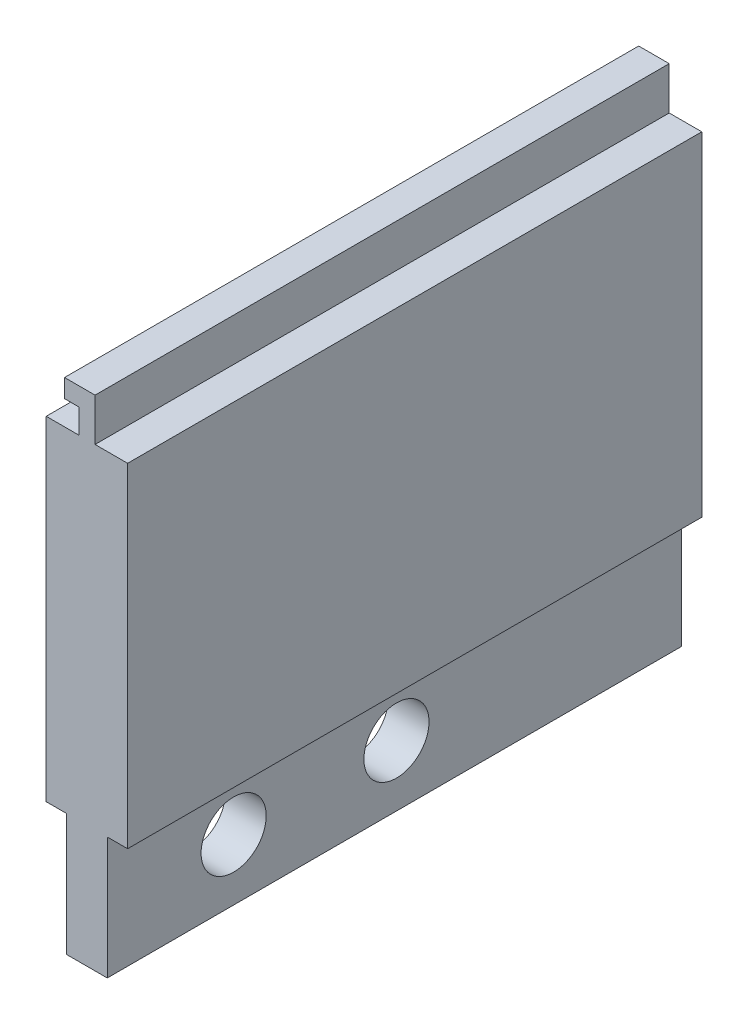
ISO-10303-21;
HEADER;
FILE_DESCRIPTION(('STEP AP214'),'2;1');
FILE_NAME('part.step','',(''),(''),'','','');
FILE_SCHEMA(('AUTOMOTIVE_DESIGN { 1 0 10303 214 1 1 1 1 }'));
ENDSEC;
DATA;
#1=APPLICATION_CONTEXT('core data for automotive mechanical design processes');
#2=APPLICATION_PROTOCOL_DEFINITION('international standard','automotive_design',2000,#1);
#3=PRODUCT_CONTEXT('',#1,'mechanical');
#4=PRODUCT('Part','Part','',(#3));
#5=PRODUCT_RELATED_PRODUCT_CATEGORY('part','',(#4));
#6=PRODUCT_DEFINITION_FORMATION('','',#4);
#7=PRODUCT_DEFINITION_CONTEXT('part definition',#1,'design');
#8=PRODUCT_DEFINITION('design','',#6,#7);
#9=PRODUCT_DEFINITION_SHAPE('','',#8);
#10=(LENGTH_UNIT() NAMED_UNIT(*) SI_UNIT(.MILLI.,.METRE.));
#11=(NAMED_UNIT(*) PLANE_ANGLE_UNIT() SI_UNIT($,.RADIAN.));
#12=(NAMED_UNIT(*) SI_UNIT($,.STERADIAN.) SOLID_ANGLE_UNIT());
#13=UNCERTAINTY_MEASURE_WITH_UNIT(LENGTH_MEASURE(1.E-05),#10,'distance_accuracy_value','');
#14=(GEOMETRIC_REPRESENTATION_CONTEXT(3) GLOBAL_UNCERTAINTY_ASSIGNED_CONTEXT((#13)) GLOBAL_UNIT_ASSIGNED_CONTEXT((#10,
#11,#12)) REPRESENTATION_CONTEXT('',''));
#15=CARTESIAN_POINT('',(0.,0.,0.));
#16=DIRECTION('',(0.,0.,1.));
#17=DIRECTION('',(1.,0.,0.));
#18=AXIS2_PLACEMENT_3D('',#15,#16,#17);
#19=CARTESIAN_POINT('',(0.,-6.19999999999896,-20.));
#20=DIRECTION('',(0.,1.,0.));
#21=DIRECTION('',(0.,0.,1.));
#22=AXIS2_PLACEMENT_3D('',#19,#20,#21);
#23=PLANE('',#22);
#24=DIRECTION('',(-1.,0.,0.));
#25=VECTOR('',#24,1.);
#26=CARTESIAN_POINT('',(0.,-6.19999999999896,0.));
#27=LINE('',#26,#25);
#28=CARTESIAN_POINT('',(2.39999999999911,-6.19999999999896,0.));
#29=VERTEX_POINT('',#28);
#30=CARTESIAN_POINT('',(0.899999999999033,-6.19999999999896,0.));
#31=VERTEX_POINT('',#30);
#32=EDGE_CURVE('E189',#29,#31,#27,.T.);
#33=ORIENTED_EDGE('',*,*,#32,.F.);
#34=DIRECTION('',(0.,0.,1.));
#35=VECTOR('',#34,1.);
#36=CARTESIAN_POINT('',(2.39999999999911,-6.19999999999896,-20.));
#37=LINE('',#36,#35);
#38=CARTESIAN_POINT('',(2.39999999999911,-6.19999999999896,-28.2085117858416));
#39=VERTEX_POINT('',#38);
#40=EDGE_CURVE('E11',#39,#29,#37,.T.);
#41=ORIENTED_EDGE('',*,*,#40,.F.);
#42=DIRECTION('',(-1.,0.,0.));
#43=VECTOR('',#42,1.);
#44=CARTESIAN_POINT('',(0.899999999999032,-6.19999999999896,-28.2085117858416));
#45=LINE('',#44,#43);
#46=CARTESIAN_POINT('',(0.899999999999033,-6.19999999999896,-28.2085117858416));
#47=VERTEX_POINT('',#46);
#48=EDGE_CURVE('E331',#39,#47,#45,.T.);
#49=ORIENTED_EDGE('',*,*,#48,.T.);
#50=DIRECTION('',(0.,0.,1.));
#51=VECTOR('',#50,1.);
#52=CARTESIAN_POINT('',(0.899999999999033,-6.19999999999896,-20.));
#53=LINE('',#52,#51);
#54=EDGE_CURVE('E232',#47,#31,#53,.T.);
#55=ORIENTED_EDGE('',*,*,#54,.T.);
#56=EDGE_LOOP('',(#33,#41,#49,#55));
#57=FACE_BOUND('',#56,.T.);
#58=ADVANCED_FACE('F45',(#57),#23,.T.);
#59=CARTESIAN_POINT('',(2.39999999999911,0.,-20.));
#60=DIRECTION('',(-1.,0.,0.));
#61=DIRECTION('',(0.,-1.,0.));
#62=AXIS2_PLACEMENT_3D('',#59,#60,#61);
#63=PLANE('',#62);
#64=DIRECTION('',(0.,-1.,0.));
#65=VECTOR('',#64,1.);
#66=CARTESIAN_POINT('',(2.39999999999911,0.,0.));
#67=LINE('',#66,#65);
#68=CARTESIAN_POINT('',(2.39999999999912,-8.29999999999899,0.));
#69=VERTEX_POINT('',#68);
#70=EDGE_CURVE('E230',#29,#69,#67,.T.);
#71=ORIENTED_EDGE('',*,*,#70,.T.);
#72=DIRECTION('',(0.,0.,1.));
#73=VECTOR('',#72,1.);
#74=CARTESIAN_POINT('',(2.39999999999912,-8.29999999999899,-20.));
#75=LINE('',#74,#73);
#76=CARTESIAN_POINT('',(2.39999999999912,-8.29999999999899,-28.2085117858416));
#77=VERTEX_POINT('',#76);
#78=EDGE_CURVE('E54',#77,#69,#75,.T.);
#79=ORIENTED_EDGE('',*,*,#78,.F.);
#80=DIRECTION('',(0.,1.,0.));
#81=VECTOR('',#80,1.);
#82=CARTESIAN_POINT('',(2.39999999999911,-6.19999999999896,-28.2085117858416));
#83=LINE('',#82,#81);
#84=EDGE_CURVE('E329',#77,#39,#83,.T.);
#85=ORIENTED_EDGE('',*,*,#84,.T.);
#86=ORIENTED_EDGE('',*,*,#40,.T.);
#87=EDGE_LOOP('',(#71,#79,#85,#86));
#88=FACE_BOUND('',#87,.T.);
#89=ADVANCED_FACE('F341',(#88),#63,.F.);
#90=CARTESIAN_POINT('',(0.,-8.29999999999899,-20.));
#91=DIRECTION('',(0.,1.,0.));
#92=DIRECTION('',(-1.,0.,0.));
#93=AXIS2_PLACEMENT_3D('',#90,#91,#92);
#94=PLANE('',#93);
#95=DIRECTION('',(-1.,0.,0.));
#96=VECTOR('',#95,1.);
#97=CARTESIAN_POINT('',(0.,-8.29999999999899,0.));
#98=LINE('',#97,#96);
#99=CARTESIAN_POINT('',(3.99999999999911,-8.29999999999899,0.));
#100=VERTEX_POINT('',#99);
#101=EDGE_CURVE('E207',#100,#69,#98,.T.);
#102=ORIENTED_EDGE('',*,*,#101,.F.);
#103=DIRECTION('',(0.,0.,1.));
#104=VECTOR('',#103,1.);
#105=CARTESIAN_POINT('',(3.99999999999911,-8.29999999999899,-20.));
#106=LINE('',#105,#104);
#107=CARTESIAN_POINT('',(3.99999999999911,-8.29999999999899,-28.2085117858416));
#108=VERTEX_POINT('',#107);
#109=EDGE_CURVE('E236',#108,#100,#106,.T.);
#110=ORIENTED_EDGE('',*,*,#109,.F.);
#111=DIRECTION('',(-1.,0.,0.));
#112=VECTOR('',#111,1.);
#113=CARTESIAN_POINT('',(2.39999999999911,-8.29999999999899,-28.2085117858416));
#114=LINE('',#113,#112);
#115=EDGE_CURVE('E326',#108,#77,#114,.T.);
#116=ORIENTED_EDGE('',*,*,#115,.T.);
#117=ORIENTED_EDGE('',*,*,#78,.T.);
#118=EDGE_LOOP('',(#102,#110,#116,#117));
#119=FACE_BOUND('',#118,.T.);
#120=ADVANCED_FACE('F368',(#119),#94,.T.);
#121=CARTESIAN_POINT('',(3.9999999999991,0.,-20.));
#122=DIRECTION('',(-1.,0.,0.));
#123=DIRECTION('',(0.,-1.,0.));
#124=AXIS2_PLACEMENT_3D('',#121,#122,#123);
#125=PLANE('',#124);
#126=DIRECTION('',(0.,-1.,0.));
#127=VECTOR('',#126,1.);
#128=CARTESIAN_POINT('',(3.9999999999991,0.,0.));
#129=LINE('',#128,#127);
#130=CARTESIAN_POINT('',(3.99999999999912,-24.699999999999,0.));
#131=VERTEX_POINT('',#130);
#132=EDGE_CURVE('E227',#100,#131,#129,.T.);
#133=ORIENTED_EDGE('',*,*,#132,.T.);
#134=DIRECTION('',(0.,0.,1.));
#135=VECTOR('',#134,1.);
#136=CARTESIAN_POINT('',(3.99999999999912,-24.699999999999,-20.));
#137=LINE('',#136,#135);
#138=CARTESIAN_POINT('',(3.99999999999912,-24.699999999999,-28.2085117858416));
#139=VERTEX_POINT('',#138);
#140=EDGE_CURVE('E239',#139,#131,#137,.T.);
#141=ORIENTED_EDGE('',*,*,#140,.F.);
#142=DIRECTION('',(0.,1.,0.));
#143=VECTOR('',#142,1.);
#144=CARTESIAN_POINT('',(3.99999999999911,-8.299999999999,-28.2085117858416));
#145=LINE('',#144,#143);
#146=EDGE_CURVE('E322',#139,#108,#145,.T.);
#147=ORIENTED_EDGE('',*,*,#146,.T.);
#148=ORIENTED_EDGE('',*,*,#109,.T.);
#149=EDGE_LOOP('',(#133,#141,#147,#148));
#150=FACE_BOUND('',#149,.T.);
#151=ADVANCED_FACE('F400',(#150),#125,.F.);
#152=CARTESIAN_POINT('',(0.,-24.699999999999,-20.));
#153=DIRECTION('',(0.,1.,0.));
#154=DIRECTION('',(0.,0.,1.));
#155=AXIS2_PLACEMENT_3D('',#152,#153,#154);
#156=PLANE('',#155);
#157=DIRECTION('',(-1.,0.,0.));
#158=VECTOR('',#157,1.);
#159=CARTESIAN_POINT('',(0.,-24.699999999999,0.));
#160=LINE('',#159,#158);
#161=CARTESIAN_POINT('',(2.99999999999912,-24.699999999999,0.));
#162=VERTEX_POINT('',#161);
#163=EDGE_CURVE('E216',#131,#162,#160,.T.);
#164=ORIENTED_EDGE('',*,*,#163,.T.);
#165=DIRECTION('',(0.,0.,1.));
#166=VECTOR('',#165,1.);
#167=CARTESIAN_POINT('',(2.99999999999912,-24.699999999999,-20.));
#168=LINE('',#167,#166);
#169=CARTESIAN_POINT('',(2.99999999999912,-24.699999999999,-28.2085117858416));
#170=VERTEX_POINT('',#169);
#171=EDGE_CURVE('E243',#170,#162,#168,.T.);
#172=ORIENTED_EDGE('',*,*,#171,.F.);
#173=DIRECTION('',(1.,0.,0.));
#174=VECTOR('',#173,1.);
#175=CARTESIAN_POINT('',(3.99999999999912,-24.699999999999,-28.2085117858416));
#176=LINE('',#175,#174);
#177=EDGE_CURVE('E318',#170,#139,#176,.T.);
#178=ORIENTED_EDGE('',*,*,#177,.T.);
#179=ORIENTED_EDGE('',*,*,#140,.T.);
#180=EDGE_LOOP('',(#164,#172,#178,#179));
#181=FACE_BOUND('',#180,.T.);
#182=ADVANCED_FACE('F349',(#181),#156,.F.);
#183=CARTESIAN_POINT('',(2.99999999999912,0.,-20.));
#184=DIRECTION('',(-1.,0.,0.));
#185=DIRECTION('',(0.,-1.,0.));
#186=AXIS2_PLACEMENT_3D('',#183,#184,#185);
#187=PLANE('',#186);
#188=CARTESIAN_POINT('',(2.99999999999912,-27.6999999999988,-6.20851178584162));
#189=DIRECTION('',(1.,0.,0.));
#190=DIRECTION('',(0.,1.,0.));
#191=AXIS2_PLACEMENT_3D('',#188,#189,#190);
#192=CIRCLE('',#191,1.6);
#193=CARTESIAN_POINT('',(2.99999999999912,-26.0999999999988,-6.20851178584162));
#194=VERTEX_POINT('',#193);
#195=EDGE_CURVE('E180',#194,#194,#192,.T.);
#196=ORIENTED_EDGE('',*,*,#195,.F.);
#197=EDGE_LOOP('',(#196));
#198=FACE_BOUND('',#197,.T.);
#199=CARTESIAN_POINT('',(2.99999999999912,-27.6999999999987,-14.2085117858416));
#200=DIRECTION('',(1.,0.,0.));
#201=DIRECTION('',(0.,1.,0.));
#202=AXIS2_PLACEMENT_3D('',#199,#200,#201);
#203=CIRCLE('',#202,1.6);
#204=CARTESIAN_POINT('',(2.99999999999912,-26.0999999999988,-14.2085117858416));
#205=VERTEX_POINT('',#204);
#206=EDGE_CURVE('E185',#205,#205,#203,.T.);
#207=ORIENTED_EDGE('',*,*,#206,.F.);
#208=EDGE_LOOP('',(#207));
#209=FACE_BOUND('',#208,.T.);
#210=DIRECTION('',(0.,-1.,0.));
#211=VECTOR('',#210,1.);
#212=CARTESIAN_POINT('',(2.99999999999912,0.,0.));
#213=LINE('',#212,#211);
#214=CARTESIAN_POINT('',(2.99999999999912,-30.699999999999,0.));
#215=VERTEX_POINT('',#214);
#216=EDGE_CURVE('E224',#162,#215,#213,.T.);
#217=ORIENTED_EDGE('',*,*,#216,.T.);
#218=DIRECTION('',(0.,0.,1.));
#219=VECTOR('',#218,1.);
#220=CARTESIAN_POINT('',(2.99999999999912,-30.699999999999,-20.));
#221=LINE('',#220,#219);
#222=CARTESIAN_POINT('',(2.99999999999912,-30.699999999999,-28.2085117858416));
#223=VERTEX_POINT('',#222);
#224=EDGE_CURVE('E247',#223,#215,#221,.T.);
#225=ORIENTED_EDGE('',*,*,#224,.F.);
#226=DIRECTION('',(0.,1.,0.));
#227=VECTOR('',#226,1.);
#228=CARTESIAN_POINT('',(2.99999999999912,-24.699999999999,-28.2085117858416));
#229=LINE('',#228,#227);
#230=EDGE_CURVE('E314',#223,#170,#229,.T.);
#231=ORIENTED_EDGE('',*,*,#230,.T.);
#232=ORIENTED_EDGE('',*,*,#171,.T.);
#233=EDGE_LOOP('',(#217,#225,#231,#232));
#234=FACE_BOUND('',#233,.T.);
#235=ADVANCED_FACE('F352',(#198,#209,#234),#187,.F.);
#236=CARTESIAN_POINT('',(0.,-30.699999999999,-20.));
#237=DIRECTION('',(0.,1.,0.));
#238=DIRECTION('',(0.,0.,1.));
#239=AXIS2_PLACEMENT_3D('',#236,#237,#238);
#240=PLANE('',#239);
#241=DIRECTION('',(-1.,0.,0.));
#242=VECTOR('',#241,1.);
#243=CARTESIAN_POINT('',(0.,-30.699999999999,0.));
#244=LINE('',#243,#242);
#245=CARTESIAN_POINT('',(0.999999999999121,-30.699999999999,0.));
#246=VERTEX_POINT('',#245);
#247=EDGE_CURVE('E220',#215,#246,#244,.T.);
#248=ORIENTED_EDGE('',*,*,#247,.T.);
#249=DIRECTION('',(0.,0.,1.));
#250=VECTOR('',#249,1.);
#251=CARTESIAN_POINT('',(0.999999999999121,-30.699999999999,-20.));
#252=LINE('',#251,#250);
#253=CARTESIAN_POINT('',(0.999999999999121,-30.699999999999,-28.2085117858416));
#254=VERTEX_POINT('',#253);
#255=EDGE_CURVE('E251',#254,#246,#252,.T.);
#256=ORIENTED_EDGE('',*,*,#255,.F.);
#257=DIRECTION('',(1.,0.,0.));
#258=VECTOR('',#257,1.);
#259=CARTESIAN_POINT('',(2.99999999999912,-30.699999999999,-28.2085117858416));
#260=LINE('',#259,#258);
#261=EDGE_CURVE('E306',#254,#223,#260,.T.);
#262=ORIENTED_EDGE('',*,*,#261,.T.);
#263=ORIENTED_EDGE('',*,*,#224,.T.);
#264=EDGE_LOOP('',(#248,#256,#262,#263));
#265=FACE_BOUND('',#264,.T.);
#266=ADVANCED_FACE('F283',(#265),#240,.F.);
#267=CARTESIAN_POINT('',(0.999999999999118,0.,-20.));
#268=DIRECTION('',(-1.,0.,0.));
#269=DIRECTION('',(0.,-1.,0.));
#270=AXIS2_PLACEMENT_3D('',#267,#268,#269);
#271=PLANE('',#270);
#272=CARTESIAN_POINT('',(0.999999999999121,-27.6999999999988,-6.20851178584162));
#273=DIRECTION('',(-1.,0.,0.));
#274=DIRECTION('',(0.,-1.,0.));
#275=AXIS2_PLACEMENT_3D('',#272,#273,#274);
#276=CIRCLE('',#275,1.6);
#277=CARTESIAN_POINT('',(0.999999999999121,-29.2999999999988,-6.20851178584162));
#278=VERTEX_POINT('',#277);
#279=EDGE_CURVE('E48',#278,#278,#276,.T.);
#280=ORIENTED_EDGE('',*,*,#279,.F.);
#281=EDGE_LOOP('',(#280));
#282=FACE_BOUND('',#281,.T.);
#283=CARTESIAN_POINT('',(0.999999999999121,-27.6999999999987,-14.2085117858416));
#284=DIRECTION('',(-1.,0.,0.));
#285=DIRECTION('',(0.,-1.,0.));
#286=AXIS2_PLACEMENT_3D('',#283,#284,#285);
#287=CIRCLE('',#286,1.6);
#288=CARTESIAN_POINT('',(0.999999999999121,-29.2999999999987,-14.2085117858416));
#289=VERTEX_POINT('',#288);
#290=EDGE_CURVE('E184',#289,#289,#287,.T.);
#291=ORIENTED_EDGE('',*,*,#290,.F.);
#292=EDGE_LOOP('',(#291));
#293=FACE_BOUND('',#292,.T.);
#294=DIRECTION('',(0.,-1.,0.));
#295=VECTOR('',#294,1.);
#296=CARTESIAN_POINT('',(0.999999999999118,0.,0.));
#297=LINE('',#296,#295);
#298=CARTESIAN_POINT('',(0.99999999999912,-24.699999999999,0.));
#299=VERTEX_POINT('',#298);
#300=EDGE_CURVE('E215',#299,#246,#297,.T.);
#301=ORIENTED_EDGE('',*,*,#300,.F.);
#302=DIRECTION('',(0.,0.,1.));
#303=VECTOR('',#302,1.);
#304=CARTESIAN_POINT('',(0.99999999999912,-24.699999999999,-20.));
#305=LINE('',#304,#303);
#306=CARTESIAN_POINT('',(0.99999999999912,-24.699999999999,-28.2085117858416));
#307=VERTEX_POINT('',#306);
#308=EDGE_CURVE('E254',#307,#299,#305,.T.);
#309=ORIENTED_EDGE('',*,*,#308,.F.);
#310=DIRECTION('',(0.,-1.,0.));
#311=VECTOR('',#310,1.);
#312=CARTESIAN_POINT('',(0.999999999999121,-30.699999999999,-28.2085117858416));
#313=LINE('',#312,#311);
#314=EDGE_CURVE('E301',#307,#254,#313,.T.);
#315=ORIENTED_EDGE('',*,*,#314,.T.);
#316=ORIENTED_EDGE('',*,*,#255,.T.);
#317=EDGE_LOOP('',(#301,#309,#315,#316));
#318=FACE_BOUND('',#317,.T.);
#319=ADVANCED_FACE('F279',(#282,#293,#318),#271,.T.);
#320=CARTESIAN_POINT('',(-8.7885428101675E-13,-24.699999999999,0.));
#321=VERTEX_POINT('',#320);
#322=EDGE_CURVE('E211',#299,#321,#160,.T.);
#323=ORIENTED_EDGE('',*,*,#322,.T.);
#324=DIRECTION('',(0.,0.,1.));
#325=VECTOR('',#324,1.);
#326=CARTESIAN_POINT('',(-8.7885428101675E-13,-24.699999999999,-20.));
#327=LINE('',#326,#325);
#328=CARTESIAN_POINT('',(-8.7885428101675E-13,-24.699999999999,-28.2085117858416));
#329=VERTEX_POINT('',#328);
#330=EDGE_CURVE('E257',#329,#321,#327,.T.);
#331=ORIENTED_EDGE('',*,*,#330,.F.);
#332=DIRECTION('',(1.,0.,0.));
#333=VECTOR('',#332,1.);
#334=CARTESIAN_POINT('',(0.999999999999119,-24.699999999999,-28.2085117858416));
#335=LINE('',#334,#333);
#336=EDGE_CURVE('E298',#329,#307,#335,.T.);
#337=ORIENTED_EDGE('',*,*,#336,.T.);
#338=ORIENTED_EDGE('',*,*,#308,.T.);
#339=EDGE_LOOP('',(#323,#331,#337,#338));
#340=FACE_BOUND('',#339,.T.);
#341=ADVANCED_FACE('F282',(#340),#156,.F.);
#342=CARTESIAN_POINT('',(-8.81793526662403E-13,0.,-20.));
#343=DIRECTION('',(-1.,0.,0.));
#344=DIRECTION('',(0.,-1.,0.));
#345=AXIS2_PLACEMENT_3D('',#342,#343,#344);
#346=PLANE('',#345);
#347=DIRECTION('',(0.,-1.,0.));
#348=VECTOR('',#347,1.);
#349=CARTESIAN_POINT('',(-8.81793526662403E-13,0.,0.));
#350=LINE('',#349,#348);
#351=CARTESIAN_POINT('',(-8.80805846250713E-13,-8.29999999999899,0.));
#352=VERTEX_POINT('',#351);
#353=EDGE_CURVE('E206',#352,#321,#350,.T.);
#354=ORIENTED_EDGE('',*,*,#353,.F.);
#355=DIRECTION('',(0.,0.,1.));
#356=VECTOR('',#355,1.);
#357=CARTESIAN_POINT('',(-8.80805846250713E-13,-8.29999999999899,-20.));
#358=LINE('',#357,#356);
#359=CARTESIAN_POINT('',(-8.80805847817134E-13,-8.29999999999899,-28.2085117858416));
#360=VERTEX_POINT('',#359);
#361=EDGE_CURVE('E260',#360,#352,#358,.T.);
#362=ORIENTED_EDGE('',*,*,#361,.F.);
#363=DIRECTION('',(0.,-1.,0.));
#364=VECTOR('',#363,1.);
#365=CARTESIAN_POINT('',(-8.7885428101675E-13,-24.699999999999,-28.2085117858416));
#366=LINE('',#365,#364);
#367=EDGE_CURVE('E302',#360,#329,#366,.T.);
#368=ORIENTED_EDGE('',*,*,#367,.T.);
#369=ORIENTED_EDGE('',*,*,#330,.T.);
#370=EDGE_LOOP('',(#354,#362,#368,#369));
#371=FACE_BOUND('',#370,.T.);
#372=ADVANCED_FACE('F374',(#371),#346,.T.);
#373=CARTESIAN_POINT('',(1.59999999999911,-8.29999999999899,0.));
#374=VERTEX_POINT('',#373);
#375=EDGE_CURVE('E202',#374,#352,#98,.T.);
#376=ORIENTED_EDGE('',*,*,#375,.F.);
#377=DIRECTION('',(0.,0.,1.));
#378=VECTOR('',#377,1.);
#379=CARTESIAN_POINT('',(1.59999999999911,-8.29999999999899,-20.));
#380=LINE('',#379,#378);
#381=CARTESIAN_POINT('',(1.59999999999911,-8.29999999999899,-28.2085117858416));
#382=VERTEX_POINT('',#381);
#383=EDGE_CURVE('E157',#382,#374,#380,.T.);
#384=ORIENTED_EDGE('',*,*,#383,.F.);
#385=DIRECTION('',(-1.,0.,0.));
#386=VECTOR('',#385,1.);
#387=CARTESIAN_POINT('',(-8.82203147777638E-13,-8.29999999999899,-28.2085117858416));
#388=LINE('',#387,#386);
#389=EDGE_CURVE('E170',#382,#360,#388,.T.);
#390=ORIENTED_EDGE('',*,*,#389,.T.);
#391=ORIENTED_EDGE('',*,*,#361,.T.);
#392=EDGE_LOOP('',(#376,#384,#390,#391));
#393=FACE_BOUND('',#392,.T.);
#394=ADVANCED_FACE('F372',(#393),#94,.T.);
#395=CARTESIAN_POINT('',(1.59999999999911,0.,-20.));
#396=DIRECTION('',(-1.,0.,0.));
#397=DIRECTION('',(0.,-1.,0.));
#398=AXIS2_PLACEMENT_3D('',#395,#396,#397);
#399=PLANE('',#398);
#400=DIRECTION('',(0.,-1.,0.));
#401=VECTOR('',#400,1.);
#402=CARTESIAN_POINT('',(1.59999999999911,0.,0.));
#403=LINE('',#402,#401);
#404=CARTESIAN_POINT('',(1.59999999999911,-7.09999999999896,0.));
#405=VERTEX_POINT('',#404);
#406=EDGE_CURVE('E151',#405,#374,#403,.T.);
#407=ORIENTED_EDGE('',*,*,#406,.F.);
#408=DIRECTION('',(0.,0.,1.));
#409=VECTOR('',#408,1.);
#410=CARTESIAN_POINT('',(1.59999999999911,-7.09999999999896,-20.));
#411=LINE('',#410,#409);
#412=CARTESIAN_POINT('',(1.59999999999911,-7.09999999999896,-28.2085117858416));
#413=VERTEX_POINT('',#412);
#414=EDGE_CURVE('E146',#413,#405,#411,.T.);
#415=ORIENTED_EDGE('',*,*,#414,.F.);
#416=DIRECTION('',(0.,-1.,0.));
#417=VECTOR('',#416,1.);
#418=CARTESIAN_POINT('',(1.59999999999911,-8.299999999999,-28.2085117858416));
#419=LINE('',#418,#417);
#420=EDGE_CURVE('E149',#413,#382,#419,.T.);
#421=ORIENTED_EDGE('',*,*,#420,.T.);
#422=ORIENTED_EDGE('',*,*,#383,.T.);
#423=EDGE_LOOP('',(#407,#415,#421,#422));
#424=FACE_BOUND('',#423,.T.);
#425=ADVANCED_FACE('F148',(#424),#399,.T.);
#426=CARTESIAN_POINT('',(0.,-7.09999999999896,-20.));
#427=DIRECTION('',(0.,1.,0.));
#428=DIRECTION('',(0.,0.,1.));
#429=AXIS2_PLACEMENT_3D('',#426,#427,#428);
#430=PLANE('',#429);
#431=DIRECTION('',(-1.,0.,0.));
#432=VECTOR('',#431,1.);
#433=CARTESIAN_POINT('',(0.,-7.09999999999896,0.));
#434=LINE('',#433,#432);
#435=CARTESIAN_POINT('',(0.899999999999033,-7.09999999999896,0.));
#436=VERTEX_POINT('',#435);
#437=EDGE_CURVE('E197',#405,#436,#434,.T.);
#438=ORIENTED_EDGE('',*,*,#437,.T.);
#439=DIRECTION('',(0.,0.,1.));
#440=VECTOR('',#439,1.);
#441=CARTESIAN_POINT('',(0.899999999999033,-7.09999999999896,-20.));
#442=LINE('',#441,#440);
#443=CARTESIAN_POINT('',(0.899999999999033,-7.09999999999896,-28.2085117858416));
#444=VERTEX_POINT('',#443);
#445=EDGE_CURVE('E158',#444,#436,#442,.T.);
#446=ORIENTED_EDGE('',*,*,#445,.F.);
#447=DIRECTION('',(1.,0.,0.));
#448=VECTOR('',#447,1.);
#449=CARTESIAN_POINT('',(1.59999999999911,-7.09999999999896,-28.2085117858416));
#450=LINE('',#449,#448);
#451=EDGE_CURVE('E166',#444,#413,#450,.T.);
#452=ORIENTED_EDGE('',*,*,#451,.T.);
#453=ORIENTED_EDGE('',*,*,#414,.T.);
#454=EDGE_LOOP('',(#438,#446,#452,#453));
#455=FACE_BOUND('',#454,.T.);
#456=ADVANCED_FACE('F173',(#455),#430,.F.);
#457=CARTESIAN_POINT('',(0.899999999999033,0.,-20.));
#458=DIRECTION('',(-1.,0.,0.));
#459=DIRECTION('',(0.,0.,1.));
#460=AXIS2_PLACEMENT_3D('',#457,#458,#459);
#461=PLANE('',#460);
#462=DIRECTION('',(0.,-1.,0.));
#463=VECTOR('',#462,1.);
#464=CARTESIAN_POINT('',(0.899999999999033,0.,0.));
#465=LINE('',#464,#463);
#466=EDGE_CURVE('E193',#31,#436,#465,.T.);
#467=ORIENTED_EDGE('',*,*,#466,.F.);
#468=ORIENTED_EDGE('',*,*,#54,.F.);
#469=DIRECTION('',(0.,-1.,0.));
#470=VECTOR('',#469,1.);
#471=CARTESIAN_POINT('',(0.899999999999033,-7.09999999999896,-28.2085117858416));
#472=LINE('',#471,#470);
#473=EDGE_CURVE('E178',#47,#444,#472,.T.);
#474=ORIENTED_EDGE('',*,*,#473,.T.);
#475=ORIENTED_EDGE('',*,*,#445,.T.);
#476=EDGE_LOOP('',(#467,#468,#474,#475));
#477=FACE_BOUND('',#476,.T.);
#478=ADVANCED_FACE('F338',(#477),#461,.T.);
#479=CARTESIAN_POINT('',(0.,0.,0.));
#480=DIRECTION('',(0.,0.,1.));
#481=DIRECTION('',(1.,0.,0.));
#482=AXIS2_PLACEMENT_3D('',#479,#480,#481);
#483=PLANE('',#482);
#484=ORIENTED_EDGE('',*,*,#32,.T.);
#485=ORIENTED_EDGE('',*,*,#466,.T.);
#486=ORIENTED_EDGE('',*,*,#437,.F.);
#487=ORIENTED_EDGE('',*,*,#406,.T.);
#488=ORIENTED_EDGE('',*,*,#375,.T.);
#489=ORIENTED_EDGE('',*,*,#353,.T.);
#490=ORIENTED_EDGE('',*,*,#322,.F.);
#491=ORIENTED_EDGE('',*,*,#300,.T.);
#492=ORIENTED_EDGE('',*,*,#247,.F.);
#493=ORIENTED_EDGE('',*,*,#216,.F.);
#494=ORIENTED_EDGE('',*,*,#163,.F.);
#495=ORIENTED_EDGE('',*,*,#132,.F.);
#496=ORIENTED_EDGE('',*,*,#101,.T.);
#497=ORIENTED_EDGE('',*,*,#70,.F.);
#498=EDGE_LOOP('',(#484,#485,#486,#487,#488,#489,#490,#491,#492,#493,#494,#495,#496,#497));
#499=FACE_BOUND('',#498,.T.);
#500=ADVANCED_FACE('F292',(#499),#483,.T.);
#501=CARTESIAN_POINT('',(-8.82106887534206E-13,-27.6999999999987,-14.2085117858416));
#502=DIRECTION('',(1.,0.,0.));
#503=DIRECTION('',(0.,1.,0.));
#504=AXIS2_PLACEMENT_3D('',#501,#502,#503);
#505=CYLINDRICAL_SURFACE('',#504,1.6);
#506=ORIENTED_EDGE('',*,*,#290,.T.);
#507=EDGE_LOOP('',(#506));
#508=FACE_BOUND('',#507,.T.);
#509=ORIENTED_EDGE('',*,*,#206,.T.);
#510=EDGE_LOOP('',(#509));
#511=FACE_BOUND('',#510,.T.);
#512=ADVANCED_FACE('F391',(#508,#511),#505,.F.);
#513=CARTESIAN_POINT('',(-8.82106887534206E-13,-27.6999999999988,-6.20851178584162));
#514=DIRECTION('',(1.,0.,0.));
#515=DIRECTION('',(0.,1.,0.));
#516=AXIS2_PLACEMENT_3D('',#513,#514,#515);
#517=CYLINDRICAL_SURFACE('',#516,1.6);
#518=ORIENTED_EDGE('',*,*,#279,.T.);
#519=EDGE_LOOP('',(#518));
#520=FACE_BOUND('',#519,.T.);
#521=ORIENTED_EDGE('',*,*,#195,.T.);
#522=EDGE_LOOP('',(#521));
#523=FACE_BOUND('',#522,.T.);
#524=ADVANCED_FACE('F276',(#520,#523),#517,.F.);
#525=CARTESIAN_POINT('',(11.9999999999991,18.8000000000011,-28.2085117858416));
#526=DIRECTION('',(0.,0.,1.));
#527=DIRECTION('',(-1.,0.,0.));
#528=AXIS2_PLACEMENT_3D('',#525,#526,#527);
#529=PLANE('',#528);
#530=ORIENTED_EDGE('',*,*,#48,.F.);
#531=ORIENTED_EDGE('',*,*,#84,.F.);
#532=ORIENTED_EDGE('',*,*,#115,.F.);
#533=ORIENTED_EDGE('',*,*,#146,.F.);
#534=ORIENTED_EDGE('',*,*,#177,.F.);
#535=ORIENTED_EDGE('',*,*,#230,.F.);
#536=ORIENTED_EDGE('',*,*,#261,.F.);
#537=ORIENTED_EDGE('',*,*,#314,.F.);
#538=ORIENTED_EDGE('',*,*,#336,.F.);
#539=ORIENTED_EDGE('',*,*,#367,.F.);
#540=ORIENTED_EDGE('',*,*,#389,.F.);
#541=ORIENTED_EDGE('',*,*,#420,.F.);
#542=ORIENTED_EDGE('',*,*,#451,.F.);
#543=ORIENTED_EDGE('',*,*,#473,.F.);
#544=EDGE_LOOP('',(#530,#531,#532,#533,#534,#535,#536,#537,#538,#539,#540,#541,#542,#543));
#545=FACE_BOUND('',#544,.T.);
#546=ADVANCED_FACE('F164',(#545),#529,.F.);
#547=CLOSED_SHELL('',(#58,#89,#120,#151,#182,#235,#266,#319,#341,#372,#394,#425,#456,#478,#500,
#512,#524,#546));
#548=MANIFOLD_SOLID_BREP('B2',#547);
#549=ADVANCED_BREP_SHAPE_REPRESENTATION('',(#18,#548),#14);
#550=SHAPE_DEFINITION_REPRESENTATION(#9,#549);
ENDSEC;
END-ISO-10303-21;
